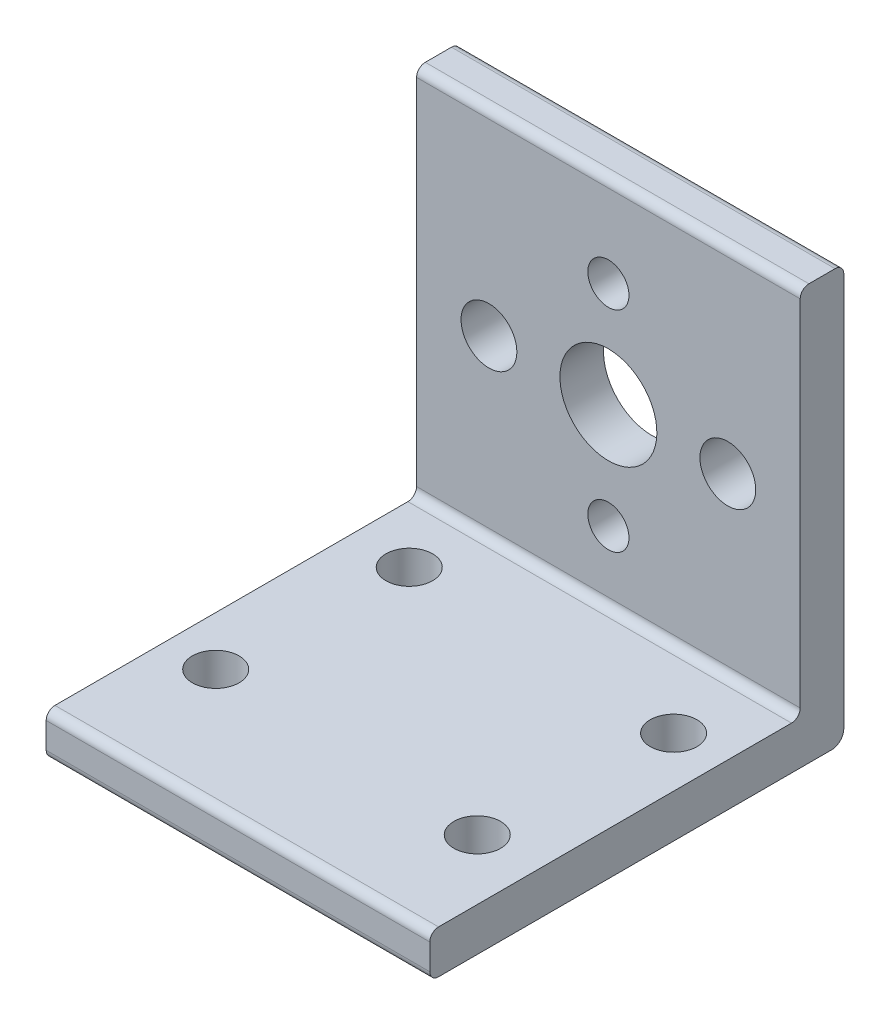
ISO-10303-21;
HEADER;
FILE_DESCRIPTION(('STEP AP214'),'2;1');
FILE_NAME('part.step','',(''),(''),'','','');
FILE_SCHEMA(('AUTOMOTIVE_DESIGN { 1 0 10303 214 1 1 1 1 }'));
ENDSEC;
DATA;
#1=APPLICATION_CONTEXT('core data for automotive mechanical design processes');
#2=APPLICATION_PROTOCOL_DEFINITION('international standard','automotive_design',2000,#1);
#3=PRODUCT_CONTEXT('',#1,'mechanical');
#4=PRODUCT('Part','Part','',(#3));
#5=PRODUCT_RELATED_PRODUCT_CATEGORY('part','',(#4));
#6=PRODUCT_DEFINITION_FORMATION('','',#4);
#7=PRODUCT_DEFINITION_CONTEXT('part definition',#1,'design');
#8=PRODUCT_DEFINITION('design','',#6,#7);
#9=PRODUCT_DEFINITION_SHAPE('','',#8);
#10=(LENGTH_UNIT() NAMED_UNIT(*) SI_UNIT(.MILLI.,.METRE.));
#11=(NAMED_UNIT(*) PLANE_ANGLE_UNIT() SI_UNIT($,.RADIAN.));
#12=(NAMED_UNIT(*) SI_UNIT($,.STERADIAN.) SOLID_ANGLE_UNIT());
#13=UNCERTAINTY_MEASURE_WITH_UNIT(LENGTH_MEASURE(1.E-05),#10,'distance_accuracy_value','');
#14=(GEOMETRIC_REPRESENTATION_CONTEXT(3) GLOBAL_UNCERTAINTY_ASSIGNED_CONTEXT((#13)) GLOBAL_UNIT_ASSIGNED_CONTEXT((#10,
#11,#12)) REPRESENTATION_CONTEXT('',''));
#15=CARTESIAN_POINT('',(0.,0.,0.));
#16=DIRECTION('',(0.,0.,1.));
#17=DIRECTION('',(1.,0.,0.));
#18=AXIS2_PLACEMENT_3D('',#15,#16,#17);
#19=CARTESIAN_POINT('',(27.94,0.,3.175));
#20=DIRECTION('',(0.,-1.,0.));
#21=DIRECTION('',(0.,0.,-1.));
#22=AXIS2_PLACEMENT_3D('',#19,#20,#21);
#23=PLANE('',#22);
#24=DIRECTION('',(0.,0.,1.));
#25=VECTOR('',#24,1.);
#26=CARTESIAN_POINT('',(27.94,0.,3.175));
#27=LINE('',#26,#25);
#28=CARTESIAN_POINT('',(27.94,0.,0.635));
#29=VERTEX_POINT('',#28);
#30=CARTESIAN_POINT('',(27.94,0.,2.54));
#31=VERTEX_POINT('',#30);
#32=EDGE_CURVE('E182',#29,#31,#27,.T.);
#33=ORIENTED_EDGE('',*,*,#32,.F.);
#34=DIRECTION('',(-1.,0.,0.));
#35=VECTOR('',#34,1.);
#36=CARTESIAN_POINT('',(27.94,0.,0.635));
#37=LINE('',#36,#35);
#38=CARTESIAN_POINT('',(0.,0.,0.635));
#39=VERTEX_POINT('',#38);
#40=EDGE_CURVE('E241',#29,#39,#37,.T.);
#41=ORIENTED_EDGE('',*,*,#40,.T.);
#42=DIRECTION('',(0.,0.,1.));
#43=VECTOR('',#42,1.);
#44=CARTESIAN_POINT('',(0.,0.,3.175));
#45=LINE('',#44,#43);
#46=CARTESIAN_POINT('',(0.,0.,2.54));
#47=VERTEX_POINT('',#46);
#48=EDGE_CURVE('E173',#39,#47,#45,.T.);
#49=ORIENTED_EDGE('',*,*,#48,.T.);
#50=DIRECTION('',(-1.,0.,0.));
#51=VECTOR('',#50,1.);
#52=CARTESIAN_POINT('',(27.94,0.,2.54));
#53=LINE('',#52,#51);
#54=EDGE_CURVE('E238',#47,#31,#53,.F.);
#55=ORIENTED_EDGE('',*,*,#54,.T.);
#56=EDGE_LOOP('',(#33,#41,#49,#55));
#57=FACE_BOUND('',#56,.T.);
#58=ADVANCED_FACE('F47',(#57),#23,.F.);
#59=CARTESIAN_POINT('',(27.94,-27.0764,3.175));
#60=DIRECTION('',(0.,0.,-1.));
#61=DIRECTION('',(0.,1.,0.));
#62=AXIS2_PLACEMENT_3D('',#59,#60,#61);
#63=PLANE('',#62);
#64=CARTESIAN_POINT('',(13.97,-6.6548,3.175));
#65=DIRECTION('',(0.,0.,-1.));
#66=DIRECTION('',(0.,1.,0.));
#67=AXIS2_PLACEMENT_3D('',#64,#65,#66);
#68=CIRCLE('',#67,1.4986);
#69=CARTESIAN_POINT('',(13.97,-5.1562,3.175));
#70=VERTEX_POINT('',#69);
#71=EDGE_CURVE('E268',#70,#70,#68,.F.);
#72=ORIENTED_EDGE('',*,*,#71,.F.);
#73=EDGE_LOOP('',(#72));
#74=FACE_BOUND('',#73,.T.);
#75=CARTESIAN_POINT('',(5.2705,-14.3002,3.175));
#76=DIRECTION('',(0.,0.,-1.));
#77=DIRECTION('',(0.,1.,0.));
#78=AXIS2_PLACEMENT_3D('',#75,#76,#77);
#79=CIRCLE('',#78,2.032);
#80=CARTESIAN_POINT('',(5.2705,-12.2682,3.175));
#81=VERTEX_POINT('',#80);
#82=EDGE_CURVE('E271',#81,#81,#79,.F.);
#83=ORIENTED_EDGE('',*,*,#82,.F.);
#84=EDGE_LOOP('',(#83));
#85=FACE_BOUND('',#84,.T.);
#86=CARTESIAN_POINT('',(22.6695,-14.3002,3.175));
#87=DIRECTION('',(0.,0.,-1.));
#88=DIRECTION('',(0.,1.,0.));
#89=AXIS2_PLACEMENT_3D('',#86,#87,#88);
#90=CIRCLE('',#89,2.032);
#91=CARTESIAN_POINT('',(22.6695,-12.2682,3.175));
#92=VERTEX_POINT('',#91);
#93=EDGE_CURVE('E289',#92,#92,#90,.F.);
#94=ORIENTED_EDGE('',*,*,#93,.F.);
#95=EDGE_LOOP('',(#94));
#96=FACE_BOUND('',#95,.T.);
#97=CARTESIAN_POINT('',(13.97,-21.9456,3.175));
#98=DIRECTION('',(0.,0.,-1.));
#99=DIRECTION('',(0.,1.,0.));
#100=AXIS2_PLACEMENT_3D('',#97,#98,#99);
#101=CIRCLE('',#100,1.4986);
#102=CARTESIAN_POINT('',(13.97,-20.447,3.175));
#103=VERTEX_POINT('',#102);
#104=EDGE_CURVE('E293',#103,#103,#101,.F.);
#105=ORIENTED_EDGE('',*,*,#104,.F.);
#106=EDGE_LOOP('',(#105));
#107=FACE_BOUND('',#106,.T.);
#108=CARTESIAN_POINT('',(13.97,-14.3002,3.175));
#109=DIRECTION('',(0.,0.,-1.));
#110=DIRECTION('',(0.,1.,0.));
#111=AXIS2_PLACEMENT_3D('',#108,#109,#110);
#112=CIRCLE('',#111,3.5306);
#113=CARTESIAN_POINT('',(13.97,-10.7696,3.175));
#114=VERTEX_POINT('',#113);
#115=EDGE_CURVE('E297',#114,#114,#112,.F.);
#116=ORIENTED_EDGE('',*,*,#115,.F.);
#117=EDGE_LOOP('',(#116));
#118=FACE_BOUND('',#117,.T.);
#119=DIRECTION('',(0.,-1.,0.));
#120=VECTOR('',#119,1.);
#121=CARTESIAN_POINT('',(27.94,-27.0764,3.175));
#122=LINE('',#121,#120);
#123=CARTESIAN_POINT('',(27.94,-0.635,3.175));
#124=VERTEX_POINT('',#123);
#125=CARTESIAN_POINT('',(27.94,-26.4414,3.175));
#126=VERTEX_POINT('',#125);
#127=EDGE_CURVE('E281',#124,#126,#122,.T.);
#128=ORIENTED_EDGE('',*,*,#127,.F.);
#129=DIRECTION('',(-1.,0.,0.));
#130=VECTOR('',#129,1.);
#131=CARTESIAN_POINT('',(27.94,-0.635,3.175));
#132=LINE('',#131,#130);
#133=CARTESIAN_POINT('',(0.,-0.635,3.175));
#134=VERTEX_POINT('',#133);
#135=EDGE_CURVE('E11',#124,#134,#132,.T.);
#136=ORIENTED_EDGE('',*,*,#135,.T.);
#137=DIRECTION('',(0.,-1.,0.));
#138=VECTOR('',#137,1.);
#139=CARTESIAN_POINT('',(0.,-27.0764,3.175));
#140=LINE('',#139,#138);
#141=CARTESIAN_POINT('',(0.,-26.4414,3.175));
#142=VERTEX_POINT('',#141);
#143=EDGE_CURVE('E166',#134,#142,#140,.T.);
#144=ORIENTED_EDGE('',*,*,#143,.T.);
#145=DIRECTION('',(-1.,0.,0.));
#146=VECTOR('',#145,1.);
#147=CARTESIAN_POINT('',(27.94,-26.4414,3.175));
#148=LINE('',#147,#146);
#149=EDGE_CURVE('E147',#142,#126,#148,.F.);
#150=ORIENTED_EDGE('',*,*,#149,.T.);
#151=EDGE_LOOP('',(#128,#136,#144,#150));
#152=FACE_BOUND('',#151,.T.);
#153=ADVANCED_FACE('F368',(#74,#85,#96,#107,#118,#152),#63,.F.);
#154=CARTESIAN_POINT('',(27.94,-27.0764,30.1498));
#155=DIRECTION('',(0.,-1.,0.));
#156=DIRECTION('',(0.,0.,-1.));
#157=AXIS2_PLACEMENT_3D('',#154,#155,#156);
#158=PLANE('',#157);
#159=CARTESIAN_POINT('',(24.2824,-27.0764,8.7376));
#160=DIRECTION('',(0.,-1.,0.));
#161=DIRECTION('',(0.,0.,-1.));
#162=AXIS2_PLACEMENT_3D('',#159,#160,#161);
#163=CIRCLE('',#162,1.7018);
#164=CARTESIAN_POINT('',(24.2824,-27.0764,7.0358));
#165=VERTEX_POINT('',#164);
#166=EDGE_CURVE('E318',#165,#165,#163,.F.);
#167=ORIENTED_EDGE('',*,*,#166,.F.);
#168=EDGE_LOOP('',(#167));
#169=FACE_BOUND('',#168,.T.);
#170=CARTESIAN_POINT('',(3.5814,-27.0764,21.3868));
#171=DIRECTION('',(0.,-1.,0.));
#172=DIRECTION('',(0.,0.,-1.));
#173=AXIS2_PLACEMENT_3D('',#170,#171,#172);
#174=CIRCLE('',#173,1.7018);
#175=CARTESIAN_POINT('',(3.5814,-27.0764,19.685));
#176=VERTEX_POINT('',#175);
#177=EDGE_CURVE('E325',#176,#176,#174,.F.);
#178=ORIENTED_EDGE('',*,*,#177,.F.);
#179=EDGE_LOOP('',(#178));
#180=FACE_BOUND('',#179,.T.);
#181=CARTESIAN_POINT('',(23.5458,-27.0764,22.3012));
#182=DIRECTION('',(0.,-1.,0.));
#183=DIRECTION('',(0.,0.,-1.));
#184=AXIS2_PLACEMENT_3D('',#181,#182,#183);
#185=CIRCLE('',#184,1.7018);
#186=CARTESIAN_POINT('',(23.5458,-27.0764,20.5994));
#187=VERTEX_POINT('',#186);
#188=EDGE_CURVE('E329',#187,#187,#185,.F.);
#189=ORIENTED_EDGE('',*,*,#188,.F.);
#190=EDGE_LOOP('',(#189));
#191=FACE_BOUND('',#190,.T.);
#192=CARTESIAN_POINT('',(4.191,-27.0764,7.89939999999999));
#193=DIRECTION('',(0.,-1.,0.));
#194=DIRECTION('',(0.,0.,-1.));
#195=AXIS2_PLACEMENT_3D('',#192,#193,#194);
#196=CIRCLE('',#195,1.7018);
#197=CARTESIAN_POINT('',(4.191,-27.0764,6.19759999999999));
#198=VERTEX_POINT('',#197);
#199=EDGE_CURVE('E333',#198,#198,#196,.F.);
#200=ORIENTED_EDGE('',*,*,#199,.F.);
#201=EDGE_LOOP('',(#200));
#202=FACE_BOUND('',#201,.T.);
#203=DIRECTION('',(0.,0.,1.));
#204=VECTOR('',#203,1.);
#205=CARTESIAN_POINT('',(0.,-27.0764,30.1498));
#206=LINE('',#205,#204);
#207=CARTESIAN_POINT('',(0.,-27.0764,3.81));
#208=VERTEX_POINT('',#207);
#209=CARTESIAN_POINT('',(0.,-27.0764,29.5148));
#210=VERTEX_POINT('',#209);
#211=EDGE_CURVE('E155',#208,#210,#206,.T.);
#212=ORIENTED_EDGE('',*,*,#211,.T.);
#213=DIRECTION('',(-1.,0.,0.));
#214=VECTOR('',#213,1.);
#215=CARTESIAN_POINT('',(27.94,-27.0764,29.5148));
#216=LINE('',#215,#214);
#217=CARTESIAN_POINT('',(27.94,-27.0764,29.5148));
#218=VERTEX_POINT('',#217);
#219=EDGE_CURVE('E63',#210,#218,#216,.F.);
#220=ORIENTED_EDGE('',*,*,#219,.T.);
#221=DIRECTION('',(0.,0.,1.));
#222=VECTOR('',#221,1.);
#223=CARTESIAN_POINT('',(27.94,-27.0764,30.1498));
#224=LINE('',#223,#222);
#225=CARTESIAN_POINT('',(27.94,-27.0764,3.81));
#226=VERTEX_POINT('',#225);
#227=EDGE_CURVE('E156',#226,#218,#224,.T.);
#228=ORIENTED_EDGE('',*,*,#227,.F.);
#229=DIRECTION('',(-1.,0.,0.));
#230=VECTOR('',#229,1.);
#231=CARTESIAN_POINT('',(0.,-27.0764,3.81));
#232=LINE('',#231,#230);
#233=EDGE_CURVE('E145',#226,#208,#232,.T.);
#234=ORIENTED_EDGE('',*,*,#233,.T.);
#235=EDGE_LOOP('',(#212,#220,#228,#234));
#236=FACE_BOUND('',#235,.T.);
#237=ADVANCED_FACE('F154',(#169,#180,#191,#202,#236),#158,.F.);
#238=CARTESIAN_POINT('',(27.94,-30.226,30.1498));
#239=DIRECTION('',(0.,0.,-1.));
#240=DIRECTION('',(-1.,0.,0.));
#241=AXIS2_PLACEMENT_3D('',#238,#239,#240);
#242=PLANE('',#241);
#243=DIRECTION('',(0.,-1.,0.));
#244=VECTOR('',#243,1.);
#245=CARTESIAN_POINT('',(0.,-30.226,30.1498));
#246=LINE('',#245,#244);
#247=CARTESIAN_POINT('',(0.,-27.7114,30.1498));
#248=VERTEX_POINT('',#247);
#249=CARTESIAN_POINT('',(0.,-29.591,30.1498));
#250=VERTEX_POINT('',#249);
#251=EDGE_CURVE('E165',#248,#250,#246,.T.);
#252=ORIENTED_EDGE('',*,*,#251,.T.);
#253=DIRECTION('',(-1.,0.,0.));
#254=VECTOR('',#253,1.);
#255=CARTESIAN_POINT('',(27.94,-29.591,30.1498));
#256=LINE('',#255,#254);
#257=CARTESIAN_POINT('',(27.94,-29.591,30.1498));
#258=VERTEX_POINT('',#257);
#259=EDGE_CURVE('E222',#250,#258,#256,.F.);
#260=ORIENTED_EDGE('',*,*,#259,.T.);
#261=DIRECTION('',(0.,-1.,0.));
#262=VECTOR('',#261,1.);
#263=CARTESIAN_POINT('',(27.94,-30.226,30.1498));
#264=LINE('',#263,#262);
#265=CARTESIAN_POINT('',(27.94,-27.7114,30.1498));
#266=VERTEX_POINT('',#265);
#267=EDGE_CURVE('E276',#266,#258,#264,.T.);
#268=ORIENTED_EDGE('',*,*,#267,.F.);
#269=DIRECTION('',(-1.,0.,0.));
#270=VECTOR('',#269,1.);
#271=CARTESIAN_POINT('',(27.94,-27.7114,30.1498));
#272=LINE('',#271,#270);
#273=EDGE_CURVE('E218',#266,#248,#272,.T.);
#274=ORIENTED_EDGE('',*,*,#273,.T.);
#275=EDGE_LOOP('',(#252,#260,#268,#274));
#276=FACE_BOUND('',#275,.T.);
#277=ADVANCED_FACE('F367',(#276),#242,.F.);
#278=CARTESIAN_POINT('',(27.94,-30.226,0.));
#279=DIRECTION('',(0.,1.,0.));
#280=DIRECTION('',(0.,0.,1.));
#281=AXIS2_PLACEMENT_3D('',#278,#279,#280);
#282=PLANE('',#281);
#283=CARTESIAN_POINT('',(24.2824,-30.226,8.7376));
#284=DIRECTION('',(0.,1.,0.));
#285=DIRECTION('',(0.,0.,1.));
#286=AXIS2_PLACEMENT_3D('',#283,#284,#285);
#287=CIRCLE('',#286,1.7018);
#288=CARTESIAN_POINT('',(24.2824,-30.226,10.4394));
#289=VERTEX_POINT('',#288);
#290=EDGE_CURVE('E341',#289,#289,#287,.T.);
#291=ORIENTED_EDGE('',*,*,#290,.T.);
#292=EDGE_LOOP('',(#291));
#293=FACE_BOUND('',#292,.T.);
#294=CARTESIAN_POINT('',(3.5814,-30.226,21.3868));
#295=DIRECTION('',(0.,1.,0.));
#296=DIRECTION('',(0.,0.,1.));
#297=AXIS2_PLACEMENT_3D('',#294,#295,#296);
#298=CIRCLE('',#297,1.7018);
#299=CARTESIAN_POINT('',(3.5814,-30.226,23.0886));
#300=VERTEX_POINT('',#299);
#301=EDGE_CURVE('E342',#300,#300,#298,.T.);
#302=ORIENTED_EDGE('',*,*,#301,.T.);
#303=EDGE_LOOP('',(#302));
#304=FACE_BOUND('',#303,.T.);
#305=CARTESIAN_POINT('',(23.5458,-30.226,22.3012));
#306=DIRECTION('',(0.,1.,0.));
#307=DIRECTION('',(0.,0.,1.));
#308=AXIS2_PLACEMENT_3D('',#305,#306,#307);
#309=CIRCLE('',#308,1.7018);
#310=CARTESIAN_POINT('',(23.5458,-30.226,24.003));
#311=VERTEX_POINT('',#310);
#312=EDGE_CURVE('E346',#311,#311,#309,.T.);
#313=ORIENTED_EDGE('',*,*,#312,.T.);
#314=EDGE_LOOP('',(#313));
#315=FACE_BOUND('',#314,.T.);
#316=CARTESIAN_POINT('',(4.191,-30.226,7.89939999999999));
#317=DIRECTION('',(0.,1.,0.));
#318=DIRECTION('',(0.,0.,1.));
#319=AXIS2_PLACEMENT_3D('',#316,#317,#318);
#320=CIRCLE('',#319,1.7018);
#321=CARTESIAN_POINT('',(4.191,-30.226,9.60119999999999));
#322=VERTEX_POINT('',#321);
#323=EDGE_CURVE('E337',#322,#322,#320,.T.);
#324=ORIENTED_EDGE('',*,*,#323,.T.);
#325=EDGE_LOOP('',(#324));
#326=FACE_BOUND('',#325,.T.);
#327=DIRECTION('',(0.,0.,-1.));
#328=VECTOR('',#327,1.);
#329=CARTESIAN_POINT('',(27.94,-30.226,0.));
#330=LINE('',#329,#328);
#331=CARTESIAN_POINT('',(27.94,-30.226,29.5148));
#332=VERTEX_POINT('',#331);
#333=CARTESIAN_POINT('',(27.94,-30.226,0.888999999999996));
#334=VERTEX_POINT('',#333);
#335=EDGE_CURVE('E259',#332,#334,#330,.T.);
#336=ORIENTED_EDGE('',*,*,#335,.F.);
#337=DIRECTION('',(-1.,0.,0.));
#338=VECTOR('',#337,1.);
#339=CARTESIAN_POINT('',(27.94,-30.226,29.5148));
#340=LINE('',#339,#338);
#341=CARTESIAN_POINT('',(0.,-30.226,29.5148));
#342=VERTEX_POINT('',#341);
#343=EDGE_CURVE('E203',#332,#342,#340,.T.);
#344=ORIENTED_EDGE('',*,*,#343,.T.);
#345=DIRECTION('',(0.,0.,-1.));
#346=VECTOR('',#345,1.);
#347=CARTESIAN_POINT('',(0.,-30.226,0.));
#348=LINE('',#347,#346);
#349=CARTESIAN_POINT('',(0.,-30.226,0.888999999999996));
#350=VERTEX_POINT('',#349);
#351=EDGE_CURVE('E171',#342,#350,#348,.T.);
#352=ORIENTED_EDGE('',*,*,#351,.T.);
#353=DIRECTION('',(-1.,0.,0.));
#354=VECTOR('',#353,1.);
#355=CARTESIAN_POINT('',(27.94,-30.226,0.888999999999996));
#356=LINE('',#355,#354);
#357=EDGE_CURVE('E196',#350,#334,#356,.F.);
#358=ORIENTED_EDGE('',*,*,#357,.T.);
#359=EDGE_LOOP('',(#336,#344,#352,#358));
#360=FACE_BOUND('',#359,.T.);
#361=ADVANCED_FACE('F354',(#293,#304,#315,#326,#360),#282,.F.);
#362=CARTESIAN_POINT('',(27.94,0.,0.));
#363=DIRECTION('',(0.,0.,1.));
#364=DIRECTION('',(0.,-1.,0.));
#365=AXIS2_PLACEMENT_3D('',#362,#363,#364);
#366=PLANE('',#365);
#367=CARTESIAN_POINT('',(13.97,-6.6548,0.));
#368=DIRECTION('',(0.,0.,1.));
#369=DIRECTION('',(1.,0.,0.));
#370=AXIS2_PLACEMENT_3D('',#367,#368,#369);
#371=CIRCLE('',#370,1.4986);
#372=CARTESIAN_POINT('',(15.4686,-6.6548,0.));
#373=VERTEX_POINT('',#372);
#374=EDGE_CURVE('E305',#373,#373,#371,.T.);
#375=ORIENTED_EDGE('',*,*,#374,.T.);
#376=EDGE_LOOP('',(#375));
#377=FACE_BOUND('',#376,.T.);
#378=CARTESIAN_POINT('',(5.2705,-14.3002,0.));
#379=DIRECTION('',(0.,0.,1.));
#380=DIRECTION('',(1.,0.,0.));
#381=AXIS2_PLACEMENT_3D('',#378,#379,#380);
#382=CIRCLE('',#381,2.032);
#383=CARTESIAN_POINT('',(7.3025,-14.3002,0.));
#384=VERTEX_POINT('',#383);
#385=EDGE_CURVE('E306',#384,#384,#382,.T.);
#386=ORIENTED_EDGE('',*,*,#385,.T.);
#387=EDGE_LOOP('',(#386));
#388=FACE_BOUND('',#387,.T.);
#389=CARTESIAN_POINT('',(22.6695,-14.3002,0.));
#390=DIRECTION('',(0.,0.,1.));
#391=DIRECTION('',(-1.,0.,0.));
#392=AXIS2_PLACEMENT_3D('',#389,#390,#391);
#393=CIRCLE('',#392,2.032);
#394=CARTESIAN_POINT('',(20.6375,-14.3002,0.));
#395=VERTEX_POINT('',#394);
#396=EDGE_CURVE('E310',#395,#395,#393,.T.);
#397=ORIENTED_EDGE('',*,*,#396,.T.);
#398=EDGE_LOOP('',(#397));
#399=FACE_BOUND('',#398,.T.);
#400=CARTESIAN_POINT('',(13.97,-21.9456,0.));
#401=DIRECTION('',(0.,0.,1.));
#402=DIRECTION('',(-1.,0.,0.));
#403=AXIS2_PLACEMENT_3D('',#400,#401,#402);
#404=CIRCLE('',#403,1.4986);
#405=CARTESIAN_POINT('',(12.4714,-21.9456,0.));
#406=VERTEX_POINT('',#405);
#407=EDGE_CURVE('E314',#406,#406,#404,.T.);
#408=ORIENTED_EDGE('',*,*,#407,.T.);
#409=EDGE_LOOP('',(#408));
#410=FACE_BOUND('',#409,.T.);
#411=CARTESIAN_POINT('',(13.97,-14.3002,0.));
#412=DIRECTION('',(0.,0.,1.));
#413=DIRECTION('',(1.,0.,0.));
#414=AXIS2_PLACEMENT_3D('',#411,#412,#413);
#415=CIRCLE('',#414,3.5306);
#416=CARTESIAN_POINT('',(17.5006,-14.3002,0.));
#417=VERTEX_POINT('',#416);
#418=EDGE_CURVE('E301',#417,#417,#415,.T.);
#419=ORIENTED_EDGE('',*,*,#418,.T.);
#420=EDGE_LOOP('',(#419));
#421=FACE_BOUND('',#420,.T.);
#422=DIRECTION('',(0.,1.,0.));
#423=VECTOR('',#422,1.);
#424=CARTESIAN_POINT('',(0.,0.,0.));
#425=LINE('',#424,#423);
#426=CARTESIAN_POINT('',(0.,-29.337,0.));
#427=VERTEX_POINT('',#426);
#428=CARTESIAN_POINT('',(0.,-0.635,0.));
#429=VERTEX_POINT('',#428);
#430=EDGE_CURVE('E179',#427,#429,#425,.T.);
#431=ORIENTED_EDGE('',*,*,#430,.T.);
#432=DIRECTION('',(-1.,0.,0.));
#433=VECTOR('',#432,1.);
#434=CARTESIAN_POINT('',(27.94,-0.635,0.));
#435=LINE('',#434,#433);
#436=CARTESIAN_POINT('',(27.94,-0.635,0.));
#437=VERTEX_POINT('',#436);
#438=EDGE_CURVE('E56',#429,#437,#435,.F.);
#439=ORIENTED_EDGE('',*,*,#438,.T.);
#440=DIRECTION('',(0.,1.,0.));
#441=VECTOR('',#440,1.);
#442=CARTESIAN_POINT('',(27.94,0.,0.));
#443=LINE('',#442,#441);
#444=CARTESIAN_POINT('',(27.94,-29.337,0.));
#445=VERTEX_POINT('',#444);
#446=EDGE_CURVE('E158',#445,#437,#443,.T.);
#447=ORIENTED_EDGE('',*,*,#446,.F.);
#448=DIRECTION('',(-1.,0.,0.));
#449=VECTOR('',#448,1.);
#450=CARTESIAN_POINT('',(27.94,-29.337,0.));
#451=LINE('',#450,#449);
#452=EDGE_CURVE('E188',#445,#427,#451,.T.);
#453=ORIENTED_EDGE('',*,*,#452,.T.);
#454=EDGE_LOOP('',(#431,#439,#447,#453));
#455=FACE_BOUND('',#454,.T.);
#456=ADVANCED_FACE('F249',(#377,#388,#399,#410,#421,#455),#366,.F.);
#457=CARTESIAN_POINT('',(27.94,0.,0.));
#458=DIRECTION('',(-1.,0.,0.));
#459=DIRECTION('',(0.,0.,1.));
#460=AXIS2_PLACEMENT_3D('',#457,#458,#459);
#461=PLANE('',#460);
#462=ORIENTED_EDGE('',*,*,#267,.T.);
#463=CARTESIAN_POINT('',(27.94,-29.591,29.5148));
#464=DIRECTION('',(-1.,0.,0.));
#465=DIRECTION('',(0.,0.,1.));
#466=AXIS2_PLACEMENT_3D('',#463,#464,#465);
#467=CIRCLE('',#466,0.635);
#468=EDGE_CURVE('E233',#258,#332,#467,.F.);
#469=ORIENTED_EDGE('',*,*,#468,.T.);
#470=ORIENTED_EDGE('',*,*,#335,.T.);
#471=CARTESIAN_POINT('',(27.94,-29.337,0.888999999999996));
#472=DIRECTION('',(-1.,0.,0.));
#473=DIRECTION('',(0.,0.,1.));
#474=AXIS2_PLACEMENT_3D('',#471,#472,#473);
#475=CIRCLE('',#474,0.889);
#476=EDGE_CURVE('E200',#334,#445,#475,.F.);
#477=ORIENTED_EDGE('',*,*,#476,.T.);
#478=ORIENTED_EDGE('',*,*,#446,.T.);
#479=CARTESIAN_POINT('',(27.94,-0.635,0.635));
#480=DIRECTION('',(-1.,0.,0.));
#481=DIRECTION('',(0.,0.,1.));
#482=AXIS2_PLACEMENT_3D('',#479,#480,#481);
#483=CIRCLE('',#482,0.635);
#484=EDGE_CURVE('E227',#437,#29,#483,.F.);
#485=ORIENTED_EDGE('',*,*,#484,.T.);
#486=ORIENTED_EDGE('',*,*,#32,.T.);
#487=CARTESIAN_POINT('',(27.94,-0.635,2.54));
#488=DIRECTION('',(-1.,0.,0.));
#489=DIRECTION('',(0.,0.,1.));
#490=AXIS2_PLACEMENT_3D('',#487,#488,#489);
#491=CIRCLE('',#490,0.635);
#492=EDGE_CURVE('E71',#31,#124,#491,.F.);
#493=ORIENTED_EDGE('',*,*,#492,.T.);
#494=ORIENTED_EDGE('',*,*,#127,.T.);
#495=CARTESIAN_POINT('',(27.94,-26.4414,3.81));
#496=DIRECTION('',(-1.,0.,0.));
#497=DIRECTION('',(0.,0.,1.));
#498=AXIS2_PLACEMENT_3D('',#495,#496,#497);
#499=CIRCLE('',#498,0.635);
#500=EDGE_CURVE('E152',#126,#226,#499,.T.);
#501=ORIENTED_EDGE('',*,*,#500,.T.);
#502=ORIENTED_EDGE('',*,*,#227,.T.);
#503=CARTESIAN_POINT('',(27.94,-27.7114,29.5148));
#504=DIRECTION('',(-1.,0.,0.));
#505=DIRECTION('',(0.,0.,1.));
#506=AXIS2_PLACEMENT_3D('',#503,#504,#505);
#507=CIRCLE('',#506,0.635);
#508=EDGE_CURVE('E230',#218,#266,#507,.F.);
#509=ORIENTED_EDGE('',*,*,#508,.T.);
#510=EDGE_LOOP('',(#462,#469,#470,#477,#478,#485,#486,#493,#494,#501,#502,#509));
#511=FACE_BOUND('',#510,.T.);
#512=ADVANCED_FACE('F255',(#511),#461,.F.);
#513=CARTESIAN_POINT('',(0.,0.,0.));
#514=DIRECTION('',(-1.,0.,0.));
#515=DIRECTION('',(0.,0.,1.));
#516=AXIS2_PLACEMENT_3D('',#513,#514,#515);
#517=PLANE('',#516);
#518=ORIENTED_EDGE('',*,*,#351,.F.);
#519=CARTESIAN_POINT('',(0.,-29.591,29.5148));
#520=DIRECTION('',(-1.,0.,0.));
#521=DIRECTION('',(0.,0.,1.));
#522=AXIS2_PLACEMENT_3D('',#519,#520,#521);
#523=CIRCLE('',#522,0.635);
#524=EDGE_CURVE('E215',#342,#250,#523,.T.);
#525=ORIENTED_EDGE('',*,*,#524,.T.);
#526=ORIENTED_EDGE('',*,*,#251,.F.);
#527=CARTESIAN_POINT('',(0.,-27.7114,29.5148));
#528=DIRECTION('',(-1.,0.,0.));
#529=DIRECTION('',(0.,0.,1.));
#530=AXIS2_PLACEMENT_3D('',#527,#528,#529);
#531=CIRCLE('',#530,0.635);
#532=EDGE_CURVE('E163',#248,#210,#531,.T.);
#533=ORIENTED_EDGE('',*,*,#532,.T.);
#534=ORIENTED_EDGE('',*,*,#211,.F.);
#535=CARTESIAN_POINT('',(0.,-26.4414,3.81));
#536=DIRECTION('',(-1.,0.,0.));
#537=DIRECTION('',(0.,0.,1.));
#538=AXIS2_PLACEMENT_3D('',#535,#536,#537);
#539=CIRCLE('',#538,0.635);
#540=EDGE_CURVE('E141',#208,#142,#539,.F.);
#541=ORIENTED_EDGE('',*,*,#540,.T.);
#542=ORIENTED_EDGE('',*,*,#143,.F.);
#543=CARTESIAN_POINT('',(0.,-0.635,2.54));
#544=DIRECTION('',(-1.,0.,0.));
#545=DIRECTION('',(0.,0.,1.));
#546=AXIS2_PLACEMENT_3D('',#543,#544,#545);
#547=CIRCLE('',#546,0.635);
#548=EDGE_CURVE('E207',#134,#47,#547,.T.);
#549=ORIENTED_EDGE('',*,*,#548,.T.);
#550=ORIENTED_EDGE('',*,*,#48,.F.);
#551=CARTESIAN_POINT('',(0.,-0.635,0.635));
#552=DIRECTION('',(-1.,0.,0.));
#553=DIRECTION('',(0.,0.,1.));
#554=AXIS2_PLACEMENT_3D('',#551,#552,#553);
#555=CIRCLE('',#554,0.635);
#556=EDGE_CURVE('E210',#39,#429,#555,.T.);
#557=ORIENTED_EDGE('',*,*,#556,.T.);
#558=ORIENTED_EDGE('',*,*,#430,.F.);
#559=CARTESIAN_POINT('',(0.,-29.337,0.888999999999996));
#560=DIRECTION('',(-1.,0.,0.));
#561=DIRECTION('',(0.,0.,1.));
#562=AXIS2_PLACEMENT_3D('',#559,#560,#561);
#563=CIRCLE('',#562,0.889);
#564=EDGE_CURVE('E192',#427,#350,#563,.T.);
#565=ORIENTED_EDGE('',*,*,#564,.T.);
#566=EDGE_LOOP('',(#518,#525,#526,#533,#534,#541,#542,#549,#550,#557,#558,#565));
#567=FACE_BOUND('',#566,.T.);
#568=ADVANCED_FACE('F161',(#567),#517,.T.);
#569=CARTESIAN_POINT('',(13.97,-14.3002,30.1498));
#570=DIRECTION('',(0.,0.,-1.));
#571=DIRECTION('',(-1.,0.,0.));
#572=AXIS2_PLACEMENT_3D('',#569,#570,#571);
#573=CYLINDRICAL_SURFACE('',#572,3.5306);
#574=ORIENTED_EDGE('',*,*,#418,.F.);
#575=EDGE_LOOP('',(#574));
#576=FACE_BOUND('',#575,.T.);
#577=ORIENTED_EDGE('',*,*,#115,.T.);
#578=EDGE_LOOP('',(#577));
#579=FACE_BOUND('',#578,.T.);
#580=ADVANCED_FACE('F441',(#576,#579),#573,.F.);
#581=CARTESIAN_POINT('',(13.97,-21.9456,30.1498));
#582=DIRECTION('',(0.,0.,-1.));
#583=DIRECTION('',(-1.,0.,0.));
#584=AXIS2_PLACEMENT_3D('',#581,#582,#583);
#585=CYLINDRICAL_SURFACE('',#584,1.4986);
#586=ORIENTED_EDGE('',*,*,#407,.F.);
#587=EDGE_LOOP('',(#586));
#588=FACE_BOUND('',#587,.T.);
#589=ORIENTED_EDGE('',*,*,#104,.T.);
#590=EDGE_LOOP('',(#589));
#591=FACE_BOUND('',#590,.T.);
#592=ADVANCED_FACE('F446',(#588,#591),#585,.F.);
#593=CARTESIAN_POINT('',(22.6695,-14.3002,30.1498));
#594=DIRECTION('',(0.,0.,-1.));
#595=DIRECTION('',(-1.,0.,0.));
#596=AXIS2_PLACEMENT_3D('',#593,#594,#595);
#597=CYLINDRICAL_SURFACE('',#596,2.032);
#598=ORIENTED_EDGE('',*,*,#396,.F.);
#599=EDGE_LOOP('',(#598));
#600=FACE_BOUND('',#599,.T.);
#601=ORIENTED_EDGE('',*,*,#93,.T.);
#602=EDGE_LOOP('',(#601));
#603=FACE_BOUND('',#602,.T.);
#604=ADVANCED_FACE('F449',(#600,#603),#597,.F.);
#605=CARTESIAN_POINT('',(5.2705,-14.3002,30.1498));
#606=DIRECTION('',(0.,0.,-1.));
#607=DIRECTION('',(-1.,0.,0.));
#608=AXIS2_PLACEMENT_3D('',#605,#606,#607);
#609=CYLINDRICAL_SURFACE('',#608,2.032);
#610=ORIENTED_EDGE('',*,*,#385,.F.);
#611=EDGE_LOOP('',(#610));
#612=FACE_BOUND('',#611,.T.);
#613=ORIENTED_EDGE('',*,*,#82,.T.);
#614=EDGE_LOOP('',(#613));
#615=FACE_BOUND('',#614,.T.);
#616=ADVANCED_FACE('F380',(#612,#615),#609,.F.);
#617=CARTESIAN_POINT('',(13.97,-6.6548,30.1498));
#618=DIRECTION('',(0.,0.,-1.));
#619=DIRECTION('',(-1.,0.,0.));
#620=AXIS2_PLACEMENT_3D('',#617,#618,#619);
#621=CYLINDRICAL_SURFACE('',#620,1.4986);
#622=ORIENTED_EDGE('',*,*,#374,.F.);
#623=EDGE_LOOP('',(#622));
#624=FACE_BOUND('',#623,.T.);
#625=ORIENTED_EDGE('',*,*,#71,.T.);
#626=EDGE_LOOP('',(#625));
#627=FACE_BOUND('',#626,.T.);
#628=ADVANCED_FACE('F374',(#624,#627),#621,.F.);
#629=CARTESIAN_POINT('',(4.191,0.,7.8994));
#630=DIRECTION('',(0.,-1.,0.));
#631=DIRECTION('',(0.,0.,-1.));
#632=AXIS2_PLACEMENT_3D('',#629,#630,#631);
#633=CYLINDRICAL_SURFACE('',#632,1.7018);
#634=ORIENTED_EDGE('',*,*,#323,.F.);
#635=EDGE_LOOP('',(#634));
#636=FACE_BOUND('',#635,.T.);
#637=ORIENTED_EDGE('',*,*,#199,.T.);
#638=EDGE_LOOP('',(#637));
#639=FACE_BOUND('',#638,.T.);
#640=ADVANCED_FACE('F361',(#636,#639),#633,.F.);
#641=CARTESIAN_POINT('',(23.5458,0.,22.3012));
#642=DIRECTION('',(0.,-1.,0.));
#643=DIRECTION('',(0.,0.,-1.));
#644=AXIS2_PLACEMENT_3D('',#641,#642,#643);
#645=CYLINDRICAL_SURFACE('',#644,1.7018);
#646=ORIENTED_EDGE('',*,*,#312,.F.);
#647=EDGE_LOOP('',(#646));
#648=FACE_BOUND('',#647,.T.);
#649=ORIENTED_EDGE('',*,*,#188,.T.);
#650=EDGE_LOOP('',(#649));
#651=FACE_BOUND('',#650,.T.);
#652=ADVANCED_FACE('F357',(#648,#651),#645,.F.);
#653=CARTESIAN_POINT('',(3.5814,0.,21.3868));
#654=DIRECTION('',(0.,-1.,0.));
#655=DIRECTION('',(0.,0.,-1.));
#656=AXIS2_PLACEMENT_3D('',#653,#654,#655);
#657=CYLINDRICAL_SURFACE('',#656,1.7018);
#658=ORIENTED_EDGE('',*,*,#301,.F.);
#659=EDGE_LOOP('',(#658));
#660=FACE_BOUND('',#659,.T.);
#661=ORIENTED_EDGE('',*,*,#177,.T.);
#662=EDGE_LOOP('',(#661));
#663=FACE_BOUND('',#662,.T.);
#664=ADVANCED_FACE('F360',(#660,#663),#657,.F.);
#665=CARTESIAN_POINT('',(24.2824,0.,8.7376));
#666=DIRECTION('',(0.,-1.,0.));
#667=DIRECTION('',(0.,0.,-1.));
#668=AXIS2_PLACEMENT_3D('',#665,#666,#667);
#669=CYLINDRICAL_SURFACE('',#668,1.7018);
#670=ORIENTED_EDGE('',*,*,#290,.F.);
#671=EDGE_LOOP('',(#670));
#672=FACE_BOUND('',#671,.T.);
#673=ORIENTED_EDGE('',*,*,#166,.T.);
#674=EDGE_LOOP('',(#673));
#675=FACE_BOUND('',#674,.T.);
#676=ADVANCED_FACE('F398',(#672,#675),#669,.F.);
#677=CARTESIAN_POINT('',(27.94,-26.4414,3.81));
#678=DIRECTION('',(1.,0.,0.));
#679=DIRECTION('',(0.,0.,-1.));
#680=AXIS2_PLACEMENT_3D('',#677,#678,#679);
#681=CYLINDRICAL_SURFACE('',#680,0.635);
#682=ORIENTED_EDGE('',*,*,#500,.F.);
#683=ORIENTED_EDGE('',*,*,#149,.F.);
#684=ORIENTED_EDGE('',*,*,#540,.F.);
#685=ORIENTED_EDGE('',*,*,#233,.F.);
#686=EDGE_LOOP('',(#682,#683,#684,#685));
#687=FACE_BOUND('',#686,.T.);
#688=ADVANCED_FACE('F144',(#687),#681,.F.);
#689=CARTESIAN_POINT('',(27.94,-29.337,0.888999999999996));
#690=DIRECTION('',(-1.,0.,0.));
#691=DIRECTION('',(0.,0.,1.));
#692=AXIS2_PLACEMENT_3D('',#689,#690,#691);
#693=CYLINDRICAL_SURFACE('',#692,0.889);
#694=ORIENTED_EDGE('',*,*,#476,.F.);
#695=ORIENTED_EDGE('',*,*,#357,.F.);
#696=ORIENTED_EDGE('',*,*,#564,.F.);
#697=ORIENTED_EDGE('',*,*,#452,.F.);
#698=EDGE_LOOP('',(#694,#695,#696,#697));
#699=FACE_BOUND('',#698,.T.);
#700=ADVANCED_FACE('F397',(#699),#693,.T.);
#701=CARTESIAN_POINT('',(27.94,-29.591,29.5148));
#702=DIRECTION('',(-1.,0.,0.));
#703=DIRECTION('',(0.,0.,1.));
#704=AXIS2_PLACEMENT_3D('',#701,#702,#703);
#705=CYLINDRICAL_SURFACE('',#704,0.635);
#706=ORIENTED_EDGE('',*,*,#468,.F.);
#707=ORIENTED_EDGE('',*,*,#259,.F.);
#708=ORIENTED_EDGE('',*,*,#524,.F.);
#709=ORIENTED_EDGE('',*,*,#343,.F.);
#710=EDGE_LOOP('',(#706,#707,#708,#709));
#711=FACE_BOUND('',#710,.T.);
#712=ADVANCED_FACE('F400',(#711),#705,.T.);
#713=CARTESIAN_POINT('',(27.94,-27.7114,29.5148));
#714=DIRECTION('',(-1.,0.,0.));
#715=DIRECTION('',(0.,0.,1.));
#716=AXIS2_PLACEMENT_3D('',#713,#714,#715);
#717=CYLINDRICAL_SURFACE('',#716,0.635);
#718=ORIENTED_EDGE('',*,*,#508,.F.);
#719=ORIENTED_EDGE('',*,*,#219,.F.);
#720=ORIENTED_EDGE('',*,*,#532,.F.);
#721=ORIENTED_EDGE('',*,*,#273,.F.);
#722=EDGE_LOOP('',(#718,#719,#720,#721));
#723=FACE_BOUND('',#722,.T.);
#724=ADVANCED_FACE('F404',(#723),#717,.T.);
#725=CARTESIAN_POINT('',(27.94,-0.635,0.635));
#726=DIRECTION('',(-1.,0.,0.));
#727=DIRECTION('',(0.,0.,1.));
#728=AXIS2_PLACEMENT_3D('',#725,#726,#727);
#729=CYLINDRICAL_SURFACE('',#728,0.635);
#730=ORIENTED_EDGE('',*,*,#484,.F.);
#731=ORIENTED_EDGE('',*,*,#438,.F.);
#732=ORIENTED_EDGE('',*,*,#556,.F.);
#733=ORIENTED_EDGE('',*,*,#40,.F.);
#734=EDGE_LOOP('',(#730,#731,#732,#733));
#735=FACE_BOUND('',#734,.T.);
#736=ADVANCED_FACE('F262',(#735),#729,.T.);
#737=CARTESIAN_POINT('',(27.94,-0.635,2.54));
#738=DIRECTION('',(-1.,0.,0.));
#739=DIRECTION('',(0.,0.,1.));
#740=AXIS2_PLACEMENT_3D('',#737,#738,#739);
#741=CYLINDRICAL_SURFACE('',#740,0.635);
#742=ORIENTED_EDGE('',*,*,#492,.F.);
#743=ORIENTED_EDGE('',*,*,#54,.F.);
#744=ORIENTED_EDGE('',*,*,#548,.F.);
#745=ORIENTED_EDGE('',*,*,#135,.F.);
#746=EDGE_LOOP('',(#742,#743,#744,#745));
#747=FACE_BOUND('',#746,.T.);
#748=ADVANCED_FACE('F49',(#747),#741,.T.);
#749=CLOSED_SHELL('',(#58,#153,#237,#277,#361,#456,#512,#568,#580,#592,#604,#616,#628,#640,#652,
#664,#676,#688,#700,#712,#724,#736,#748));
#750=MANIFOLD_SOLID_BREP('B2',#749);
#751=ADVANCED_BREP_SHAPE_REPRESENTATION('',(#18,#750),#14);
#752=SHAPE_DEFINITION_REPRESENTATION(#9,#751);
ENDSEC;
END-ISO-10303-21;
